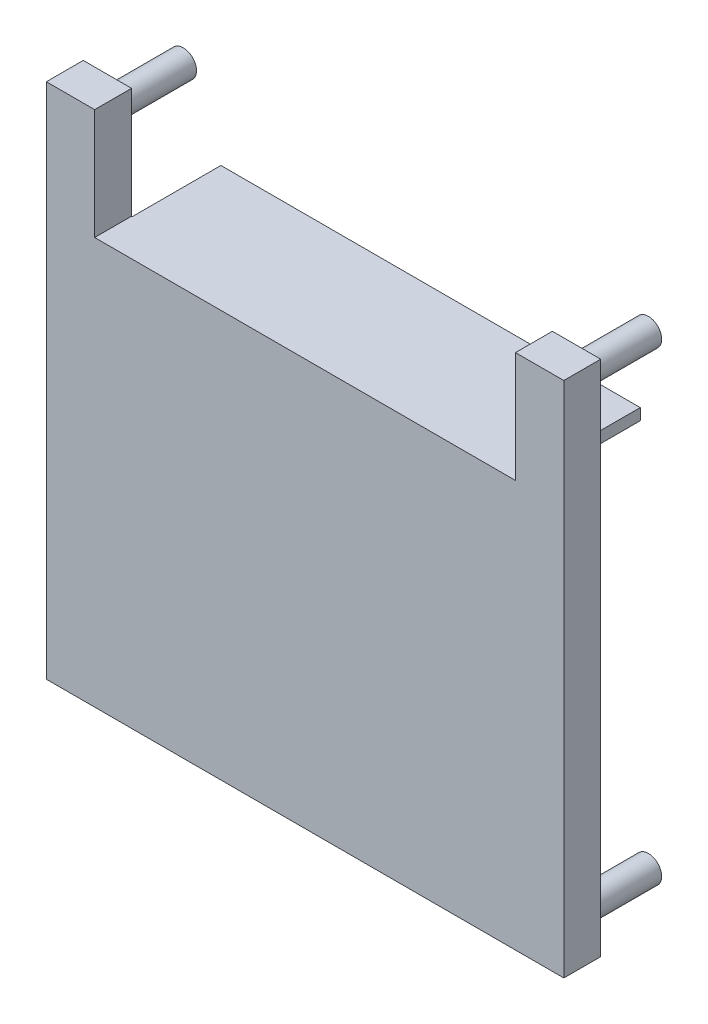
ISO-10303-21;
HEADER;
FILE_DESCRIPTION(('STEP AP214'),'2;1');
FILE_NAME('part.step','',(''),(''),'','','');
FILE_SCHEMA(('AUTOMOTIVE_DESIGN { 1 0 10303 214 1 1 1 1 }'));
ENDSEC;
DATA;
#1=APPLICATION_CONTEXT('core data for automotive mechanical design processes');
#2=APPLICATION_PROTOCOL_DEFINITION('international standard','automotive_design',2000,#1);
#3=PRODUCT_CONTEXT('',#1,'mechanical');
#4=PRODUCT('Part','Part','',(#3));
#5=PRODUCT_RELATED_PRODUCT_CATEGORY('part','',(#4));
#6=PRODUCT_DEFINITION_FORMATION('','',#4);
#7=PRODUCT_DEFINITION_CONTEXT('part definition',#1,'design');
#8=PRODUCT_DEFINITION('design','',#6,#7);
#9=PRODUCT_DEFINITION_SHAPE('','',#8);
#10=(LENGTH_UNIT() NAMED_UNIT(*) SI_UNIT(.MILLI.,.METRE.));
#11=(NAMED_UNIT(*) PLANE_ANGLE_UNIT() SI_UNIT($,.RADIAN.));
#12=(NAMED_UNIT(*) SI_UNIT($,.STERADIAN.) SOLID_ANGLE_UNIT());
#13=UNCERTAINTY_MEASURE_WITH_UNIT(LENGTH_MEASURE(1.E-05),#10,'distance_accuracy_value','');
#14=(GEOMETRIC_REPRESENTATION_CONTEXT(3) GLOBAL_UNCERTAINTY_ASSIGNED_CONTEXT((#13)) GLOBAL_UNIT_ASSIGNED_CONTEXT((#10,
#11,#12)) REPRESENTATION_CONTEXT('',''));
#15=CARTESIAN_POINT('',(0.,0.,0.));
#16=DIRECTION('',(0.,0.,1.));
#17=DIRECTION('',(1.,0.,0.));
#18=AXIS2_PLACEMENT_3D('',#15,#16,#17);
#19=CARTESIAN_POINT('',(0.,0.,0.));
#20=DIRECTION('',(0.,0.,1.));
#21=DIRECTION('',(1.,0.,0.));
#22=AXIS2_PLACEMENT_3D('',#19,#20,#21);
#23=PLANE('',#22);
#24=CARTESIAN_POINT('',(31.5000000000017,31.4999999999983,0.));
#25=DIRECTION('',(0.,0.,1.));
#26=DIRECTION('',(1.,0.,0.));
#27=AXIS2_PLACEMENT_3D('',#24,#25,#26);
#28=CIRCLE('',#27,1.8);
#29=CARTESIAN_POINT('',(33.3000000000017,31.4999999999983,0.));
#30=VERTEX_POINT('',#29);
#31=EDGE_CURVE('E350',#30,#30,#28,.T.);
#32=ORIENTED_EDGE('',*,*,#31,.T.);
#33=EDGE_LOOP('',(#32));
#34=FACE_BOUND('',#33,.T.);
#35=CARTESIAN_POINT('',(31.5,-31.5000000000017,0.));
#36=DIRECTION('',(0.,0.,1.));
#37=DIRECTION('',(1.,0.,0.));
#38=AXIS2_PLACEMENT_3D('',#35,#36,#37);
#39=CIRCLE('',#38,1.8);
#40=CARTESIAN_POINT('',(33.3,-31.5000000000017,0.));
#41=VERTEX_POINT('',#40);
#42=EDGE_CURVE('E346',#41,#41,#39,.T.);
#43=ORIENTED_EDGE('',*,*,#42,.T.);
#44=EDGE_LOOP('',(#43));
#45=FACE_BOUND('',#44,.T.);
#46=CARTESIAN_POINT('',(-31.5,-31.5,0.));
#47=DIRECTION('',(0.,0.,1.));
#48=DIRECTION('',(1.,0.,0.));
#49=AXIS2_PLACEMENT_3D('',#46,#47,#48);
#50=CIRCLE('',#49,1.8);
#51=CARTESIAN_POINT('',(-29.7,-31.5,0.));
#52=VERTEX_POINT('',#51);
#53=EDGE_CURVE('E338',#52,#52,#50,.T.);
#54=ORIENTED_EDGE('',*,*,#53,.T.);
#55=EDGE_LOOP('',(#54));
#56=FACE_BOUND('',#55,.T.);
#57=CARTESIAN_POINT('',(-31.4999999999983,31.5,0.));
#58=DIRECTION('',(0.,0.,1.));
#59=DIRECTION('',(1.,0.,0.));
#60=AXIS2_PLACEMENT_3D('',#57,#58,#59);
#61=CIRCLE('',#60,1.8);
#62=CARTESIAN_POINT('',(-29.6999999999983,31.5,0.));
#63=VERTEX_POINT('',#62);
#64=EDGE_CURVE('E330',#63,#63,#61,.T.);
#65=ORIENTED_EDGE('',*,*,#64,.T.);
#66=EDGE_LOOP('',(#65));
#67=FACE_BOUND('',#66,.T.);
#68=DIRECTION('',(0.,-1.,0.));
#69=VECTOR('',#68,1.);
#70=CARTESIAN_POINT('',(-8.,-1.5,0.));
#71=LINE('',#70,#69);
#72=CARTESIAN_POINT('',(-7.99999999999999,18.5,0.));
#73=VERTEX_POINT('',#72);
#74=CARTESIAN_POINT('',(-8.,-1.5,0.));
#75=VERTEX_POINT('',#74);
#76=EDGE_CURVE('E203',#73,#75,#71,.T.);
#77=ORIENTED_EDGE('',*,*,#76,.F.);
#78=DIRECTION('',(-1.,0.,0.));
#79=VECTOR('',#78,1.);
#80=CARTESIAN_POINT('',(28.4,18.5,0.));
#81=LINE('',#80,#79);
#82=CARTESIAN_POINT('',(16.5,18.5,0.));
#83=VERTEX_POINT('',#82);
#84=EDGE_CURVE('E277',#83,#73,#81,.T.);
#85=ORIENTED_EDGE('',*,*,#84,.F.);
#86=DIRECTION('',(0.,1.,0.));
#87=VECTOR('',#86,1.);
#88=CARTESIAN_POINT('',(16.5,0.5,0.));
#89=LINE('',#88,#87);
#90=CARTESIAN_POINT('',(16.5,0.5,0.));
#91=VERTEX_POINT('',#90);
#92=EDGE_CURVE('E221',#91,#83,#89,.T.);
#93=ORIENTED_EDGE('',*,*,#92,.F.);
#94=DIRECTION('',(-1.,0.,0.));
#95=VECTOR('',#94,1.);
#96=CARTESIAN_POINT('',(22.5,0.5,0.));
#97=LINE('',#96,#95);
#98=CARTESIAN_POINT('',(22.5,0.5,0.));
#99=VERTEX_POINT('',#98);
#100=EDGE_CURVE('E210',#99,#91,#97,.T.);
#101=ORIENTED_EDGE('',*,*,#100,.F.);
#102=DIRECTION('',(0.,-1.,0.));
#103=VECTOR('',#102,1.);
#104=CARTESIAN_POINT('',(22.5,0.5,0.));
#105=LINE('',#104,#103);
#106=CARTESIAN_POINT('',(22.5,18.5,0.));
#107=VERTEX_POINT('',#106);
#108=EDGE_CURVE('E205',#107,#99,#105,.T.);
#109=ORIENTED_EDGE('',*,*,#108,.F.);
#110=CARTESIAN_POINT('',(28.4,18.5,0.));
#111=VERTEX_POINT('',#110);
#112=EDGE_CURVE('E273',#111,#107,#81,.T.);
#113=ORIENTED_EDGE('',*,*,#112,.F.);
#114=DIRECTION('',(0.,-1.,0.));
#115=VECTOR('',#114,1.);
#116=CARTESIAN_POINT('',(28.4,20.045,0.));
#117=LINE('',#116,#115);
#118=CARTESIAN_POINT('',(28.4,20.045,0.));
#119=VERTEX_POINT('',#118);
#120=EDGE_CURVE('E253',#119,#111,#117,.T.);
#121=ORIENTED_EDGE('',*,*,#120,.F.);
#122=DIRECTION('',(-1.,0.,0.));
#123=VECTOR('',#122,1.);
#124=CARTESIAN_POINT('',(-28.5,20.045,0.));
#125=LINE('',#124,#123);
#126=CARTESIAN_POINT('',(28.5,20.045,0.));
#127=VERTEX_POINT('',#126);
#128=EDGE_CURVE('E307',#127,#119,#125,.T.);
#129=ORIENTED_EDGE('',*,*,#128,.F.);
#130=DIRECTION('',(0.,1.,0.));
#131=VECTOR('',#130,1.);
#132=CARTESIAN_POINT('',(28.5,20.045,0.));
#133=LINE('',#132,#131);
#134=CARTESIAN_POINT('',(28.5,35.045,0.));
#135=VERTEX_POINT('',#134);
#136=EDGE_CURVE('E320',#127,#135,#133,.T.);
#137=ORIENTED_EDGE('',*,*,#136,.T.);
#138=DIRECTION('',(-1.,0.,0.));
#139=VECTOR('',#138,1.);
#140=CARTESIAN_POINT('',(-35.045,35.045,0.));
#141=LINE('',#140,#139);
#142=CARTESIAN_POINT('',(35.045,35.045,0.));
#143=VERTEX_POINT('',#142);
#144=EDGE_CURVE('E383',#143,#135,#141,.T.);
#145=ORIENTED_EDGE('',*,*,#144,.F.);
#146=DIRECTION('',(0.,1.,0.));
#147=VECTOR('',#146,1.);
#148=CARTESIAN_POINT('',(35.045,35.045,0.));
#149=LINE('',#148,#147);
#150=CARTESIAN_POINT('',(35.045,-35.045,0.));
#151=VERTEX_POINT('',#150);
#152=EDGE_CURVE('E358',#151,#143,#149,.T.);
#153=ORIENTED_EDGE('',*,*,#152,.F.);
#154=DIRECTION('',(1.,0.,0.));
#155=VECTOR('',#154,1.);
#156=CARTESIAN_POINT('',(-35.045,-35.045,0.));
#157=LINE('',#156,#155);
#158=CARTESIAN_POINT('',(-35.045,-35.045,0.));
#159=VERTEX_POINT('',#158);
#160=EDGE_CURVE('E367',#159,#151,#157,.T.);
#161=ORIENTED_EDGE('',*,*,#160,.F.);
#162=DIRECTION('',(0.,-1.,0.));
#163=VECTOR('',#162,1.);
#164=CARTESIAN_POINT('',(-35.045,35.045,0.));
#165=LINE('',#164,#163);
#166=CARTESIAN_POINT('',(-35.045,35.045,0.));
#167=VERTEX_POINT('',#166);
#168=EDGE_CURVE('E387',#167,#159,#165,.T.);
#169=ORIENTED_EDGE('',*,*,#168,.F.);
#170=CARTESIAN_POINT('',(-28.5,35.045,0.));
#171=VERTEX_POINT('',#170);
#172=EDGE_CURVE('E382',#171,#167,#141,.T.);
#173=ORIENTED_EDGE('',*,*,#172,.F.);
#174=DIRECTION('',(0.,1.,0.));
#175=VECTOR('',#174,1.);
#176=CARTESIAN_POINT('',(-28.5,20.045,0.));
#177=LINE('',#176,#175);
#178=CARTESIAN_POINT('',(-28.5,20.045,0.));
#179=VERTEX_POINT('',#178);
#180=EDGE_CURVE('E316',#179,#171,#177,.T.);
#181=ORIENTED_EDGE('',*,*,#180,.F.);
#182=CARTESIAN_POINT('',(-28.4,20.045,0.));
#183=VERTEX_POINT('',#182);
#184=EDGE_CURVE('E306',#183,#179,#125,.T.);
#185=ORIENTED_EDGE('',*,*,#184,.F.);
#186=DIRECTION('',(0.,1.,0.));
#187=VECTOR('',#186,1.);
#188=CARTESIAN_POINT('',(-28.4,20.045,0.));
#189=LINE('',#188,#187);
#190=CARTESIAN_POINT('',(-28.4,18.5,0.));
#191=VERTEX_POINT('',#190);
#192=EDGE_CURVE('E259',#191,#183,#189,.T.);
#193=ORIENTED_EDGE('',*,*,#192,.F.);
#194=CARTESIAN_POINT('',(-23.,18.5,0.));
#195=VERTEX_POINT('',#194);
#196=EDGE_CURVE('E272',#195,#191,#81,.T.);
#197=ORIENTED_EDGE('',*,*,#196,.F.);
#198=DIRECTION('',(0.,1.,0.));
#199=VECTOR('',#198,1.);
#200=CARTESIAN_POINT('',(-23.,-1.5,0.));
#201=LINE('',#200,#199);
#202=CARTESIAN_POINT('',(-23.,-1.5,0.));
#203=VERTEX_POINT('',#202);
#204=EDGE_CURVE('E64',#203,#195,#201,.T.);
#205=ORIENTED_EDGE('',*,*,#204,.F.);
#206=DIRECTION('',(-1.,0.,0.));
#207=VECTOR('',#206,1.);
#208=CARTESIAN_POINT('',(-8.,-1.5,0.));
#209=LINE('',#208,#207);
#210=EDGE_CURVE('E59',#75,#203,#209,.T.);
#211=ORIENTED_EDGE('',*,*,#210,.F.);
#212=EDGE_LOOP('',(#77,#85,#93,#101,#109,#113,#121,#129,#137,#145,#153,#161,#169,#173,#181,#185,
#193,#197,#205,#211));
#213=FACE_BOUND('',#212,.T.);
#214=ADVANCED_FACE('F43',(#34,#45,#56,#67,#213),#23,.F.);
#215=CARTESIAN_POINT('',(28.4,18.5,-12.));
#216=DIRECTION('',(0.,1.,0.));
#217=DIRECTION('',(0.,0.,1.));
#218=AXIS2_PLACEMENT_3D('',#215,#216,#217);
#219=PLANE('',#218);
#220=DIRECTION('',(0.,0.,1.));
#221=VECTOR('',#220,1.);
#222=CARTESIAN_POINT('',(-8.,18.5,-2.));
#223=LINE('',#222,#221);
#224=CARTESIAN_POINT('',(-8.,18.5,-2.));
#225=VERTEX_POINT('',#224);
#226=EDGE_CURVE('E789',#225,#73,#223,.T.);
#227=ORIENTED_EDGE('',*,*,#226,.F.);
#228=DIRECTION('',(1.,0.,0.));
#229=VECTOR('',#228,1.);
#230=CARTESIAN_POINT('',(-8.,18.5,-2.));
#231=LINE('',#230,#229);
#232=CARTESIAN_POINT('',(-23.,18.5,-2.));
#233=VERTEX_POINT('',#232);
#234=EDGE_CURVE('E197',#233,#225,#231,.T.);
#235=ORIENTED_EDGE('',*,*,#234,.F.);
#236=DIRECTION('',(0.,0.,1.));
#237=VECTOR('',#236,1.);
#238=CARTESIAN_POINT('',(-23.,18.5,-2.));
#239=LINE('',#238,#237);
#240=EDGE_CURVE('E212',#233,#195,#239,.T.);
#241=ORIENTED_EDGE('',*,*,#240,.T.);
#242=ORIENTED_EDGE('',*,*,#196,.T.);
#243=DIRECTION('',(0.,0.,1.));
#244=VECTOR('',#243,1.);
#245=CARTESIAN_POINT('',(-28.4,18.5,-12.));
#246=LINE('',#245,#244);
#247=CARTESIAN_POINT('',(-28.4,18.5,-12.));
#248=VERTEX_POINT('',#247);
#249=EDGE_CURVE('E286',#248,#191,#246,.T.);
#250=ORIENTED_EDGE('',*,*,#249,.F.);
#251=DIRECTION('',(-1.,0.,0.));
#252=VECTOR('',#251,1.);
#253=CARTESIAN_POINT('',(28.4,18.5,-12.));
#254=LINE('',#253,#252);
#255=CARTESIAN_POINT('',(28.4,18.5,-12.));
#256=VERTEX_POINT('',#255);
#257=EDGE_CURVE('E258',#256,#248,#254,.T.);
#258=ORIENTED_EDGE('',*,*,#257,.F.);
#259=DIRECTION('',(0.,0.,1.));
#260=VECTOR('',#259,1.);
#261=CARTESIAN_POINT('',(28.4,18.5,-12.));
#262=LINE('',#261,#260);
#263=EDGE_CURVE('E290',#256,#111,#262,.T.);
#264=ORIENTED_EDGE('',*,*,#263,.T.);
#265=ORIENTED_EDGE('',*,*,#112,.T.);
#266=DIRECTION('',(0.,0.,1.));
#267=VECTOR('',#266,1.);
#268=CARTESIAN_POINT('',(22.5,18.5,-3.7));
#269=LINE('',#268,#267);
#270=CARTESIAN_POINT('',(22.5,18.5,-3.7));
#271=VERTEX_POINT('',#270);
#272=EDGE_CURVE('E231',#271,#107,#269,.T.);
#273=ORIENTED_EDGE('',*,*,#272,.F.);
#274=DIRECTION('',(1.,0.,0.));
#275=VECTOR('',#274,1.);
#276=CARTESIAN_POINT('',(22.5,18.5,-3.7));
#277=LINE('',#276,#275);
#278=CARTESIAN_POINT('',(16.5,18.5,-3.7));
#279=VERTEX_POINT('',#278);
#280=EDGE_CURVE('E228',#279,#271,#277,.T.);
#281=ORIENTED_EDGE('',*,*,#280,.F.);
#282=DIRECTION('',(0.,0.,1.));
#283=VECTOR('',#282,1.);
#284=CARTESIAN_POINT('',(16.5,18.5,-3.7));
#285=LINE('',#284,#283);
#286=EDGE_CURVE('E242',#279,#83,#285,.T.);
#287=ORIENTED_EDGE('',*,*,#286,.T.);
#288=ORIENTED_EDGE('',*,*,#84,.T.);
#289=EDGE_LOOP('',(#227,#235,#241,#242,#250,#258,#264,#265,#273,#281,#287,#288));
#290=FACE_BOUND('',#289,.T.);
#291=ADVANCED_FACE('F432',(#290),#219,.F.);
#292=CARTESIAN_POINT('',(-35.045,35.045,5.));
#293=DIRECTION('',(0.,-1.,0.));
#294=DIRECTION('',(0.,0.,-1.));
#295=AXIS2_PLACEMENT_3D('',#292,#293,#294);
#296=PLANE('',#295);
#297=DIRECTION('',(-1.,0.,0.));
#298=VECTOR('',#297,1.);
#299=CARTESIAN_POINT('',(-35.045,35.045,5.));
#300=LINE('',#299,#298);
#301=CARTESIAN_POINT('',(-28.5,35.045,5.));
#302=VERTEX_POINT('',#301);
#303=CARTESIAN_POINT('',(-35.045,35.045,5.));
#304=VERTEX_POINT('',#303);
#305=EDGE_CURVE('E366',#302,#304,#300,.T.);
#306=ORIENTED_EDGE('',*,*,#305,.F.);
#307=DIRECTION('',(0.,0.,1.));
#308=VECTOR('',#307,1.);
#309=CARTESIAN_POINT('',(-28.5,35.045,5.));
#310=LINE('',#309,#308);
#311=EDGE_CURVE('E293',#171,#302,#310,.T.);
#312=ORIENTED_EDGE('',*,*,#311,.F.);
#313=ORIENTED_EDGE('',*,*,#172,.T.);
#314=DIRECTION('',(0.,0.,-1.));
#315=VECTOR('',#314,1.);
#316=CARTESIAN_POINT('',(-35.045,35.045,5.));
#317=LINE('',#316,#315);
#318=EDGE_CURVE('E52',#304,#167,#317,.T.);
#319=ORIENTED_EDGE('',*,*,#318,.F.);
#320=EDGE_LOOP('',(#306,#312,#313,#319));
#321=FACE_BOUND('',#320,.T.);
#322=ADVANCED_FACE('F446',(#321),#296,.F.);
#323=CARTESIAN_POINT('',(35.045,35.045,5.));
#324=DIRECTION('',(-1.,0.,0.));
#325=DIRECTION('',(0.,-1.,0.));
#326=AXIS2_PLACEMENT_3D('',#323,#324,#325);
#327=PLANE('',#326);
#328=ORIENTED_EDGE('',*,*,#152,.T.);
#329=DIRECTION('',(0.,0.,-1.));
#330=VECTOR('',#329,1.);
#331=CARTESIAN_POINT('',(35.045,35.045,5.));
#332=LINE('',#331,#330);
#333=CARTESIAN_POINT('',(35.045,35.045,5.));
#334=VERTEX_POINT('',#333);
#335=EDGE_CURVE('E11',#334,#143,#332,.T.);
#336=ORIENTED_EDGE('',*,*,#335,.F.);
#337=DIRECTION('',(0.,1.,0.));
#338=VECTOR('',#337,1.);
#339=CARTESIAN_POINT('',(35.045,35.045,5.));
#340=LINE('',#339,#338);
#341=CARTESIAN_POINT('',(35.045,-35.045,5.));
#342=VERTEX_POINT('',#341);
#343=EDGE_CURVE('E362',#342,#334,#340,.T.);
#344=ORIENTED_EDGE('',*,*,#343,.F.);
#345=DIRECTION('',(0.,0.,-1.));
#346=VECTOR('',#345,1.);
#347=CARTESIAN_POINT('',(35.045,-35.045,5.));
#348=LINE('',#347,#346);
#349=EDGE_CURVE('E378',#342,#151,#348,.T.);
#350=ORIENTED_EDGE('',*,*,#349,.T.);
#351=EDGE_LOOP('',(#328,#336,#344,#350));
#352=FACE_BOUND('',#351,.T.);
#353=ADVANCED_FACE('F45',(#352),#327,.F.);
#354=ORIENTED_EDGE('',*,*,#144,.T.);
#355=DIRECTION('',(0.,0.,-1.));
#356=VECTOR('',#355,1.);
#357=CARTESIAN_POINT('',(28.5,35.045,5.));
#358=LINE('',#357,#356);
#359=CARTESIAN_POINT('',(28.5,35.045,5.));
#360=VERTEX_POINT('',#359);
#361=EDGE_CURVE('E299',#360,#135,#358,.T.);
#362=ORIENTED_EDGE('',*,*,#361,.F.);
#363=EDGE_CURVE('E368',#334,#360,#300,.T.);
#364=ORIENTED_EDGE('',*,*,#363,.F.);
#365=ORIENTED_EDGE('',*,*,#335,.T.);
#366=EDGE_LOOP('',(#354,#362,#364,#365));
#367=FACE_BOUND('',#366,.T.);
#368=ADVANCED_FACE('F448',(#367),#296,.F.);
#369=CARTESIAN_POINT('',(-35.045,35.045,5.));
#370=DIRECTION('',(1.,0.,0.));
#371=DIRECTION('',(0.,0.,-1.));
#372=AXIS2_PLACEMENT_3D('',#369,#370,#371);
#373=PLANE('',#372);
#374=ORIENTED_EDGE('',*,*,#168,.T.);
#375=DIRECTION('',(0.,0.,-1.));
#376=VECTOR('',#375,1.);
#377=CARTESIAN_POINT('',(-35.045,-35.045,5.));
#378=LINE('',#377,#376);
#379=CARTESIAN_POINT('',(-35.045,-35.045,5.));
#380=VERTEX_POINT('',#379);
#381=EDGE_CURVE('E395',#380,#159,#378,.T.);
#382=ORIENTED_EDGE('',*,*,#381,.F.);
#383=DIRECTION('',(0.,-1.,0.));
#384=VECTOR('',#383,1.);
#385=CARTESIAN_POINT('',(-35.045,35.045,5.));
#386=LINE('',#385,#384);
#387=EDGE_CURVE('E372',#304,#380,#386,.T.);
#388=ORIENTED_EDGE('',*,*,#387,.F.);
#389=ORIENTED_EDGE('',*,*,#318,.T.);
#390=EDGE_LOOP('',(#374,#382,#388,#389));
#391=FACE_BOUND('',#390,.T.);
#392=ADVANCED_FACE('F404',(#391),#373,.F.);
#393=CARTESIAN_POINT('',(-35.045,-35.045,5.));
#394=DIRECTION('',(0.,1.,0.));
#395=DIRECTION('',(0.,0.,1.));
#396=AXIS2_PLACEMENT_3D('',#393,#394,#395);
#397=PLANE('',#396);
#398=ORIENTED_EDGE('',*,*,#160,.T.);
#399=ORIENTED_EDGE('',*,*,#349,.F.);
#400=DIRECTION('',(1.,0.,0.));
#401=VECTOR('',#400,1.);
#402=CARTESIAN_POINT('',(-35.045,-35.045,5.));
#403=LINE('',#402,#401);
#404=EDGE_CURVE('E375',#380,#342,#403,.T.);
#405=ORIENTED_EDGE('',*,*,#404,.F.);
#406=ORIENTED_EDGE('',*,*,#381,.T.);
#407=EDGE_LOOP('',(#398,#399,#405,#406));
#408=FACE_BOUND('',#407,.T.);
#409=ADVANCED_FACE('F414',(#408),#397,.F.);
#410=CARTESIAN_POINT('',(0.,0.,5.));
#411=DIRECTION('',(0.,0.,1.));
#412=DIRECTION('',(1.,0.,0.));
#413=AXIS2_PLACEMENT_3D('',#410,#411,#412);
#414=PLANE('',#413);
#415=DIRECTION('',(0.,1.,0.));
#416=VECTOR('',#415,1.);
#417=CARTESIAN_POINT('',(-28.5,20.045,5.));
#418=LINE('',#417,#416);
#419=CARTESIAN_POINT('',(-28.5,20.045,5.));
#420=VERTEX_POINT('',#419);
#421=EDGE_CURVE('E311',#420,#302,#418,.T.);
#422=ORIENTED_EDGE('',*,*,#421,.T.);
#423=ORIENTED_EDGE('',*,*,#305,.T.);
#424=ORIENTED_EDGE('',*,*,#387,.T.);
#425=ORIENTED_EDGE('',*,*,#404,.T.);
#426=ORIENTED_EDGE('',*,*,#343,.T.);
#427=ORIENTED_EDGE('',*,*,#363,.T.);
#428=DIRECTION('',(0.,1.,0.));
#429=VECTOR('',#428,1.);
#430=CARTESIAN_POINT('',(28.5,20.045,5.));
#431=LINE('',#430,#429);
#432=CARTESIAN_POINT('',(28.5,20.045,5.));
#433=VERTEX_POINT('',#432);
#434=EDGE_CURVE('E324',#433,#360,#431,.T.);
#435=ORIENTED_EDGE('',*,*,#434,.F.);
#436=DIRECTION('',(1.,0.,0.));
#437=VECTOR('',#436,1.);
#438=CARTESIAN_POINT('',(-28.5,20.045,5.));
#439=LINE('',#438,#437);
#440=EDGE_CURVE('E298',#420,#433,#439,.T.);
#441=ORIENTED_EDGE('',*,*,#440,.F.);
#442=EDGE_LOOP('',(#422,#423,#424,#425,#426,#427,#435,#441));
#443=FACE_BOUND('',#442,.T.);
#444=ADVANCED_FACE('F420',(#443),#414,.T.);
#445=CARTESIAN_POINT('',(31.5000000000017,31.4999999999983,-10.));
#446=DIRECTION('',(0.,0.,1.));
#447=DIRECTION('',(1.,0.,0.));
#448=AXIS2_PLACEMENT_3D('',#445,#446,#447);
#449=CYLINDRICAL_SURFACE('',#448,1.8);
#450=CARTESIAN_POINT('',(31.5000000000017,31.4999999999983,-10.));
#451=DIRECTION('',(0.,0.,1.));
#452=DIRECTION('',(1.,0.,0.));
#453=AXIS2_PLACEMENT_3D('',#450,#451,#452);
#454=CIRCLE('',#453,1.8);
#455=CARTESIAN_POINT('',(33.3000000000017,31.4999999999983,-10.));
#456=VERTEX_POINT('',#455);
#457=EDGE_CURVE('E354',#456,#456,#454,.T.);
#458=ORIENTED_EDGE('',*,*,#457,.T.);
#459=EDGE_LOOP('',(#458));
#460=FACE_BOUND('',#459,.T.);
#461=ORIENTED_EDGE('',*,*,#31,.F.);
#462=EDGE_LOOP('',(#461));
#463=FACE_BOUND('',#462,.T.);
#464=ADVANCED_FACE('F484',(#460,#463),#449,.T.);
#465=CARTESIAN_POINT('',(31.5000000000017,31.4999999999983,-10.));
#466=DIRECTION('',(0.,0.,1.));
#467=DIRECTION('',(1.,0.,0.));
#468=AXIS2_PLACEMENT_3D('',#465,#466,#467);
#469=PLANE('',#468);
#470=ORIENTED_EDGE('',*,*,#457,.F.);
#471=EDGE_LOOP('',(#470));
#472=FACE_BOUND('',#471,.T.);
#473=ADVANCED_FACE('F490',(#472),#469,.F.);
#474=CARTESIAN_POINT('',(31.5,-31.5000000000017,-10.));
#475=DIRECTION('',(0.,0.,1.));
#476=DIRECTION('',(1.,0.,0.));
#477=AXIS2_PLACEMENT_3D('',#474,#475,#476);
#478=CYLINDRICAL_SURFACE('',#477,1.8);
#479=CARTESIAN_POINT('',(31.5,-31.5000000000017,-10.));
#480=DIRECTION('',(0.,0.,1.));
#481=DIRECTION('',(1.,0.,0.));
#482=AXIS2_PLACEMENT_3D('',#479,#480,#481);
#483=CIRCLE('',#482,1.8);
#484=CARTESIAN_POINT('',(33.3,-31.5000000000017,-10.));
#485=VERTEX_POINT('',#484);
#486=EDGE_CURVE('E342',#485,#485,#483,.T.);
#487=ORIENTED_EDGE('',*,*,#486,.T.);
#488=EDGE_LOOP('',(#487));
#489=FACE_BOUND('',#488,.T.);
#490=ORIENTED_EDGE('',*,*,#42,.F.);
#491=EDGE_LOOP('',(#490));
#492=FACE_BOUND('',#491,.T.);
#493=ADVANCED_FACE('F497',(#489,#492),#478,.T.);
#494=CARTESIAN_POINT('',(31.5,-31.5000000000017,-10.));
#495=DIRECTION('',(0.,0.,1.));
#496=DIRECTION('',(1.,0.,0.));
#497=AXIS2_PLACEMENT_3D('',#494,#495,#496);
#498=PLANE('',#497);
#499=ORIENTED_EDGE('',*,*,#486,.F.);
#500=EDGE_LOOP('',(#499));
#501=FACE_BOUND('',#500,.T.);
#502=ADVANCED_FACE('F505',(#501),#498,.F.);
#503=CARTESIAN_POINT('',(-31.5,-31.5,-10.));
#504=DIRECTION('',(0.,0.,1.));
#505=DIRECTION('',(1.,0.,0.));
#506=AXIS2_PLACEMENT_3D('',#503,#504,#505);
#507=CYLINDRICAL_SURFACE('',#506,1.8);
#508=CARTESIAN_POINT('',(-31.5,-31.5,-10.));
#509=DIRECTION('',(0.,0.,1.));
#510=DIRECTION('',(1.,0.,0.));
#511=AXIS2_PLACEMENT_3D('',#508,#509,#510);
#512=CIRCLE('',#511,1.8);
#513=CARTESIAN_POINT('',(-29.7,-31.5,-10.));
#514=VERTEX_POINT('',#513);
#515=EDGE_CURVE('E334',#514,#514,#512,.T.);
#516=ORIENTED_EDGE('',*,*,#515,.T.);
#517=EDGE_LOOP('',(#516));
#518=FACE_BOUND('',#517,.T.);
#519=ORIENTED_EDGE('',*,*,#53,.F.);
#520=EDGE_LOOP('',(#519));
#521=FACE_BOUND('',#520,.T.);
#522=ADVANCED_FACE('F513',(#518,#521),#507,.T.);
#523=CARTESIAN_POINT('',(-31.5,-31.5,-10.));
#524=DIRECTION('',(0.,0.,1.));
#525=DIRECTION('',(1.,0.,0.));
#526=AXIS2_PLACEMENT_3D('',#523,#524,#525);
#527=PLANE('',#526);
#528=ORIENTED_EDGE('',*,*,#515,.F.);
#529=EDGE_LOOP('',(#528));
#530=FACE_BOUND('',#529,.T.);
#531=ADVANCED_FACE('F521',(#530),#527,.F.);
#532=CARTESIAN_POINT('',(-31.4999999999983,31.5,-10.));
#533=DIRECTION('',(0.,0.,1.));
#534=DIRECTION('',(1.,0.,0.));
#535=AXIS2_PLACEMENT_3D('',#532,#533,#534);
#536=CYLINDRICAL_SURFACE('',#535,1.8);
#537=CARTESIAN_POINT('',(-31.4999999999983,31.5,-10.));
#538=DIRECTION('',(0.,0.,1.));
#539=DIRECTION('',(1.,0.,0.));
#540=AXIS2_PLACEMENT_3D('',#537,#538,#539);
#541=CIRCLE('',#540,1.8);
#542=CARTESIAN_POINT('',(-29.6999999999983,31.5,-10.));
#543=VERTEX_POINT('',#542);
#544=EDGE_CURVE('E319',#543,#543,#541,.T.);
#545=ORIENTED_EDGE('',*,*,#544,.T.);
#546=EDGE_LOOP('',(#545));
#547=FACE_BOUND('',#546,.T.);
#548=ORIENTED_EDGE('',*,*,#64,.F.);
#549=EDGE_LOOP('',(#548));
#550=FACE_BOUND('',#549,.T.);
#551=ADVANCED_FACE('F529',(#547,#550),#536,.T.);
#552=CARTESIAN_POINT('',(-31.4999999999983,31.5,-10.));
#553=DIRECTION('',(0.,0.,1.));
#554=DIRECTION('',(1.,0.,0.));
#555=AXIS2_PLACEMENT_3D('',#552,#553,#554);
#556=PLANE('',#555);
#557=ORIENTED_EDGE('',*,*,#544,.F.);
#558=EDGE_LOOP('',(#557));
#559=FACE_BOUND('',#558,.T.);
#560=ADVANCED_FACE('F537',(#559),#556,.F.);
#561=CARTESIAN_POINT('',(-28.5,20.045,5.));
#562=DIRECTION('',(-1.,0.,0.));
#563=DIRECTION('',(0.,0.,1.));
#564=AXIS2_PLACEMENT_3D('',#561,#562,#563);
#565=PLANE('',#564);
#566=ORIENTED_EDGE('',*,*,#311,.T.);
#567=ORIENTED_EDGE('',*,*,#421,.F.);
#568=DIRECTION('',(0.,0.,1.));
#569=VECTOR('',#568,1.);
#570=CARTESIAN_POINT('',(-28.5,20.045,5.));
#571=LINE('',#570,#569);
#572=EDGE_CURVE('E294',#179,#420,#571,.T.);
#573=ORIENTED_EDGE('',*,*,#572,.F.);
#574=ORIENTED_EDGE('',*,*,#180,.T.);
#575=EDGE_LOOP('',(#566,#567,#573,#574));
#576=FACE_BOUND('',#575,.T.);
#577=ADVANCED_FACE('F445',(#576),#565,.F.);
#578=CARTESIAN_POINT('',(28.5,20.045,5.));
#579=DIRECTION('',(1.,0.,0.));
#580=DIRECTION('',(0.,0.,-1.));
#581=AXIS2_PLACEMENT_3D('',#578,#579,#580);
#582=PLANE('',#581);
#583=ORIENTED_EDGE('',*,*,#361,.T.);
#584=ORIENTED_EDGE('',*,*,#136,.F.);
#585=DIRECTION('',(0.,0.,-1.));
#586=VECTOR('',#585,1.);
#587=CARTESIAN_POINT('',(28.5,20.045,5.));
#588=LINE('',#587,#586);
#589=EDGE_CURVE('E303',#433,#127,#588,.T.);
#590=ORIENTED_EDGE('',*,*,#589,.F.);
#591=ORIENTED_EDGE('',*,*,#434,.T.);
#592=EDGE_LOOP('',(#583,#584,#590,#591));
#593=FACE_BOUND('',#592,.T.);
#594=ADVANCED_FACE('F551',(#593),#582,.F.);
#595=CARTESIAN_POINT('',(0.,20.045,0.));
#596=DIRECTION('',(0.,-1.,0.));
#597=DIRECTION('',(0.,0.,-1.));
#598=AXIS2_PLACEMENT_3D('',#595,#596,#597);
#599=PLANE('',#598);
#600=ORIENTED_EDGE('',*,*,#572,.T.);
#601=ORIENTED_EDGE('',*,*,#440,.T.);
#602=ORIENTED_EDGE('',*,*,#589,.T.);
#603=ORIENTED_EDGE('',*,*,#128,.T.);
#604=DIRECTION('',(0.,0.,1.));
#605=VECTOR('',#604,1.);
#606=CARTESIAN_POINT('',(28.4,20.045,-12.));
#607=LINE('',#606,#605);
#608=CARTESIAN_POINT('',(28.4,20.045,-12.));
#609=VERTEX_POINT('',#608);
#610=EDGE_CURVE('E268',#609,#119,#607,.T.);
#611=ORIENTED_EDGE('',*,*,#610,.F.);
#612=DIRECTION('',(1.,0.,0.));
#613=VECTOR('',#612,1.);
#614=CARTESIAN_POINT('',(28.4,20.045,-12.));
#615=LINE('',#614,#613);
#616=CARTESIAN_POINT('',(-28.4,20.045,-12.));
#617=VERTEX_POINT('',#616);
#618=EDGE_CURVE('E265',#617,#609,#615,.T.);
#619=ORIENTED_EDGE('',*,*,#618,.F.);
#620=DIRECTION('',(0.,0.,1.));
#621=VECTOR('',#620,1.);
#622=CARTESIAN_POINT('',(-28.4,20.045,-12.));
#623=LINE('',#622,#621);
#624=EDGE_CURVE('E283',#617,#183,#623,.T.);
#625=ORIENTED_EDGE('',*,*,#624,.T.);
#626=ORIENTED_EDGE('',*,*,#184,.T.);
#627=EDGE_LOOP('',(#600,#601,#602,#603,#611,#619,#625,#626));
#628=FACE_BOUND('',#627,.T.);
#629=ADVANCED_FACE('F442',(#628),#599,.F.);
#630=CARTESIAN_POINT('',(28.4,20.045,-12.));
#631=DIRECTION('',(-1.,0.,0.));
#632=DIRECTION('',(0.,0.,1.));
#633=AXIS2_PLACEMENT_3D('',#630,#631,#632);
#634=PLANE('',#633);
#635=ORIENTED_EDGE('',*,*,#120,.T.);
#636=ORIENTED_EDGE('',*,*,#263,.F.);
#637=DIRECTION('',(0.,-1.,0.));
#638=VECTOR('',#637,1.);
#639=CARTESIAN_POINT('',(28.4,20.045,-12.));
#640=LINE('',#639,#638);
#641=EDGE_CURVE('E254',#609,#256,#640,.T.);
#642=ORIENTED_EDGE('',*,*,#641,.F.);
#643=ORIENTED_EDGE('',*,*,#610,.T.);
#644=EDGE_LOOP('',(#635,#636,#642,#643));
#645=FACE_BOUND('',#644,.T.);
#646=ADVANCED_FACE('F565',(#645),#634,.F.);
#647=CARTESIAN_POINT('',(-28.4,20.045,-12.));
#648=DIRECTION('',(1.,0.,0.));
#649=DIRECTION('',(0.,0.,-1.));
#650=AXIS2_PLACEMENT_3D('',#647,#648,#649);
#651=PLANE('',#650);
#652=ORIENTED_EDGE('',*,*,#192,.T.);
#653=ORIENTED_EDGE('',*,*,#624,.F.);
#654=DIRECTION('',(0.,1.,0.));
#655=VECTOR('',#654,1.);
#656=CARTESIAN_POINT('',(-28.4,20.045,-12.));
#657=LINE('',#656,#655);
#658=EDGE_CURVE('E262',#248,#617,#657,.T.);
#659=ORIENTED_EDGE('',*,*,#658,.F.);
#660=ORIENTED_EDGE('',*,*,#249,.T.);
#661=EDGE_LOOP('',(#652,#653,#659,#660));
#662=FACE_BOUND('',#661,.T.);
#663=ADVANCED_FACE('F437',(#662),#651,.F.);
#664=CARTESIAN_POINT('',(0.,0.,-12.));
#665=DIRECTION('',(0.,0.,-1.));
#666=DIRECTION('',(-1.,0.,0.));
#667=AXIS2_PLACEMENT_3D('',#664,#665,#666);
#668=PLANE('',#667);
#669=ORIENTED_EDGE('',*,*,#641,.T.);
#670=ORIENTED_EDGE('',*,*,#257,.T.);
#671=ORIENTED_EDGE('',*,*,#658,.T.);
#672=ORIENTED_EDGE('',*,*,#618,.T.);
#673=EDGE_LOOP('',(#669,#670,#671,#672));
#674=FACE_BOUND('',#673,.T.);
#675=ADVANCED_FACE('F579',(#674),#668,.T.);
#676=CARTESIAN_POINT('',(22.5,0.5,-3.7));
#677=DIRECTION('',(-1.,0.,0.));
#678=DIRECTION('',(0.,0.,1.));
#679=AXIS2_PLACEMENT_3D('',#676,#677,#678);
#680=PLANE('',#679);
#681=ORIENTED_EDGE('',*,*,#108,.T.);
#682=DIRECTION('',(0.,0.,1.));
#683=VECTOR('',#682,1.);
#684=CARTESIAN_POINT('',(22.5,0.5,-3.7));
#685=LINE('',#684,#683);
#686=CARTESIAN_POINT('',(22.5,0.5,-3.7));
#687=VERTEX_POINT('',#686);
#688=EDGE_CURVE('E249',#687,#99,#685,.T.);
#689=ORIENTED_EDGE('',*,*,#688,.F.);
#690=DIRECTION('',(0.,-1.,0.));
#691=VECTOR('',#690,1.);
#692=CARTESIAN_POINT('',(22.5,0.5,-3.7));
#693=LINE('',#692,#691);
#694=EDGE_CURVE('E216',#271,#687,#693,.T.);
#695=ORIENTED_EDGE('',*,*,#694,.F.);
#696=ORIENTED_EDGE('',*,*,#272,.T.);
#697=EDGE_LOOP('',(#681,#689,#695,#696));
#698=FACE_BOUND('',#697,.T.);
#699=ADVANCED_FACE('F586',(#698),#680,.F.);
#700=CARTESIAN_POINT('',(22.5,0.5,-3.7));
#701=DIRECTION('',(0.,1.,0.));
#702=DIRECTION('',(0.,0.,1.));
#703=AXIS2_PLACEMENT_3D('',#700,#701,#702);
#704=PLANE('',#703);
#705=ORIENTED_EDGE('',*,*,#100,.T.);
#706=DIRECTION('',(0.,0.,1.));
#707=VECTOR('',#706,1.);
#708=CARTESIAN_POINT('',(16.5,0.5,-3.7));
#709=LINE('',#708,#707);
#710=CARTESIAN_POINT('',(16.5,0.5,-3.7));
#711=VERTEX_POINT('',#710);
#712=EDGE_CURVE('E245',#711,#91,#709,.T.);
#713=ORIENTED_EDGE('',*,*,#712,.F.);
#714=DIRECTION('',(-1.,0.,0.));
#715=VECTOR('',#714,1.);
#716=CARTESIAN_POINT('',(22.5,0.5,-3.7));
#717=LINE('',#716,#715);
#718=EDGE_CURVE('E220',#687,#711,#717,.T.);
#719=ORIENTED_EDGE('',*,*,#718,.F.);
#720=ORIENTED_EDGE('',*,*,#688,.T.);
#721=EDGE_LOOP('',(#705,#713,#719,#720));
#722=FACE_BOUND('',#721,.T.);
#723=ADVANCED_FACE('F594',(#722),#704,.F.);
#724=CARTESIAN_POINT('',(16.5,0.5,-3.7));
#725=DIRECTION('',(1.,0.,0.));
#726=DIRECTION('',(0.,0.,-1.));
#727=AXIS2_PLACEMENT_3D('',#724,#725,#726);
#728=PLANE('',#727);
#729=ORIENTED_EDGE('',*,*,#92,.T.);
#730=ORIENTED_EDGE('',*,*,#286,.F.);
#731=DIRECTION('',(0.,1.,0.));
#732=VECTOR('',#731,1.);
#733=CARTESIAN_POINT('',(16.5,0.5,-3.7));
#734=LINE('',#733,#732);
#735=EDGE_CURVE('E224',#711,#279,#734,.T.);
#736=ORIENTED_EDGE('',*,*,#735,.F.);
#737=ORIENTED_EDGE('',*,*,#712,.T.);
#738=EDGE_LOOP('',(#729,#730,#736,#737));
#739=FACE_BOUND('',#738,.T.);
#740=ADVANCED_FACE('F602',(#739),#728,.F.);
#741=CARTESIAN_POINT('',(0.,0.,-3.7));
#742=DIRECTION('',(0.,0.,1.));
#743=DIRECTION('',(1.,0.,0.));
#744=AXIS2_PLACEMENT_3D('',#741,#742,#743);
#745=PLANE('',#744);
#746=ORIENTED_EDGE('',*,*,#694,.T.);
#747=ORIENTED_EDGE('',*,*,#718,.T.);
#748=ORIENTED_EDGE('',*,*,#735,.T.);
#749=ORIENTED_EDGE('',*,*,#280,.T.);
#750=EDGE_LOOP('',(#746,#747,#748,#749));
#751=FACE_BOUND('',#750,.T.);
#752=ADVANCED_FACE('F610',(#751),#745,.F.);
#753=CARTESIAN_POINT('',(-8.,-1.5,-2.));
#754=DIRECTION('',(-1.,0.,0.));
#755=DIRECTION('',(0.,0.,1.));
#756=AXIS2_PLACEMENT_3D('',#753,#754,#755);
#757=PLANE('',#756);
#758=ORIENTED_EDGE('',*,*,#76,.T.);
#759=DIRECTION('',(0.,0.,1.));
#760=VECTOR('',#759,1.);
#761=CARTESIAN_POINT('',(-8.,-1.5,-2.));
#762=LINE('',#761,#760);
#763=CARTESIAN_POINT('',(-8.,-1.5,-2.));
#764=VERTEX_POINT('',#763);
#765=EDGE_CURVE('E183',#764,#75,#762,.T.);
#766=ORIENTED_EDGE('',*,*,#765,.F.);
#767=DIRECTION('',(0.,-1.,0.));
#768=VECTOR('',#767,1.);
#769=CARTESIAN_POINT('',(-8.,-1.5,-2.));
#770=LINE('',#769,#768);
#771=EDGE_CURVE('E192',#225,#764,#770,.T.);
#772=ORIENTED_EDGE('',*,*,#771,.F.);
#773=ORIENTED_EDGE('',*,*,#226,.T.);
#774=EDGE_LOOP('',(#758,#766,#772,#773));
#775=FACE_BOUND('',#774,.T.);
#776=ADVANCED_FACE('F202',(#775),#757,.F.);
#777=CARTESIAN_POINT('',(-8.,-1.5,-2.));
#778=DIRECTION('',(0.,1.,0.));
#779=DIRECTION('',(0.,0.,1.));
#780=AXIS2_PLACEMENT_3D('',#777,#778,#779);
#781=PLANE('',#780);
#782=ORIENTED_EDGE('',*,*,#210,.T.);
#783=DIRECTION('',(0.,0.,1.));
#784=VECTOR('',#783,1.);
#785=CARTESIAN_POINT('',(-23.,-1.5,-2.));
#786=LINE('',#785,#784);
#787=CARTESIAN_POINT('',(-23.,-1.5,-2.));
#788=VERTEX_POINT('',#787);
#789=EDGE_CURVE('E186',#788,#203,#786,.T.);
#790=ORIENTED_EDGE('',*,*,#789,.F.);
#791=DIRECTION('',(-1.,0.,0.));
#792=VECTOR('',#791,1.);
#793=CARTESIAN_POINT('',(-8.,-1.5,-2.));
#794=LINE('',#793,#792);
#795=EDGE_CURVE('E179',#764,#788,#794,.T.);
#796=ORIENTED_EDGE('',*,*,#795,.F.);
#797=ORIENTED_EDGE('',*,*,#765,.T.);
#798=EDGE_LOOP('',(#782,#790,#796,#797));
#799=FACE_BOUND('',#798,.T.);
#800=ADVANCED_FACE('F181',(#799),#781,.F.);
#801=CARTESIAN_POINT('',(-23.,-1.5,-2.));
#802=DIRECTION('',(1.,0.,0.));
#803=DIRECTION('',(0.,1.,0.));
#804=AXIS2_PLACEMENT_3D('',#801,#802,#803);
#805=PLANE('',#804);
#806=ORIENTED_EDGE('',*,*,#204,.T.);
#807=ORIENTED_EDGE('',*,*,#240,.F.);
#808=DIRECTION('',(0.,1.,0.));
#809=VECTOR('',#808,1.);
#810=CARTESIAN_POINT('',(-23.,-1.5,-2.));
#811=LINE('',#810,#809);
#812=EDGE_CURVE('E191',#788,#233,#811,.T.);
#813=ORIENTED_EDGE('',*,*,#812,.F.);
#814=ORIENTED_EDGE('',*,*,#789,.T.);
#815=EDGE_LOOP('',(#806,#807,#813,#814));
#816=FACE_BOUND('',#815,.T.);
#817=ADVANCED_FACE('F632',(#816),#805,.F.);
#818=CARTESIAN_POINT('',(0.,0.,-2.));
#819=DIRECTION('',(0.,0.,1.));
#820=DIRECTION('',(1.,0.,0.));
#821=AXIS2_PLACEMENT_3D('',#818,#819,#820);
#822=PLANE('',#821);
#823=ORIENTED_EDGE('',*,*,#771,.T.);
#824=ORIENTED_EDGE('',*,*,#795,.T.);
#825=ORIENTED_EDGE('',*,*,#812,.T.);
#826=ORIENTED_EDGE('',*,*,#234,.T.);
#827=EDGE_LOOP('',(#823,#824,#825,#826));
#828=FACE_BOUND('',#827,.T.);
#829=ADVANCED_FACE('F196',(#828),#822,.F.);
#830=CLOSED_SHELL('',(#214,#291,#322,#353,#368,#392,#409,#444,#464,#473,#493,#502,#522,#531,
#551,#560,#577,#594,#629,#646,#663,#675,#699,#723,#740,#752,#776,#800,#817,#829));
#831=MANIFOLD_SOLID_BREP('B2',#830);
#832=ADVANCED_BREP_SHAPE_REPRESENTATION('',(#18,#831),#14);
#833=SHAPE_DEFINITION_REPRESENTATION(#9,#832);
ENDSEC;
END-ISO-10303-21;
